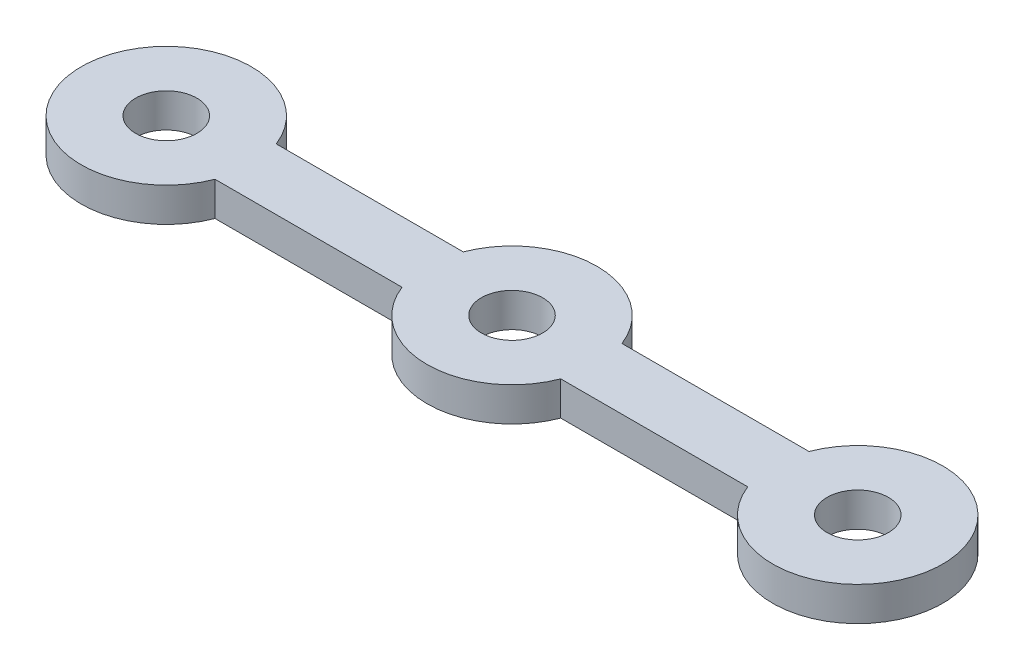
ISO-10303-21;
HEADER;
FILE_DESCRIPTION(('STEP AP214'),'2;1');
FILE_NAME('part.step','',(''),(''),'','','');
FILE_SCHEMA(('AUTOMOTIVE_DESIGN { 1 0 10303 214 1 1 1 1 }'));
ENDSEC;
DATA;
#1=APPLICATION_CONTEXT('core data for automotive mechanical design processes');
#2=APPLICATION_PROTOCOL_DEFINITION('international standard','automotive_design',2000,#1);
#3=PRODUCT_CONTEXT('',#1,'mechanical');
#4=PRODUCT('Part','Part','',(#3));
#5=PRODUCT_RELATED_PRODUCT_CATEGORY('part','',(#4));
#6=PRODUCT_DEFINITION_FORMATION('','',#4);
#7=PRODUCT_DEFINITION_CONTEXT('part definition',#1,'design');
#8=PRODUCT_DEFINITION('design','',#6,#7);
#9=PRODUCT_DEFINITION_SHAPE('','',#8);
#10=(LENGTH_UNIT() NAMED_UNIT(*) SI_UNIT(.MILLI.,.METRE.));
#11=(NAMED_UNIT(*) PLANE_ANGLE_UNIT() SI_UNIT($,.RADIAN.));
#12=(NAMED_UNIT(*) SI_UNIT($,.STERADIAN.) SOLID_ANGLE_UNIT());
#13=UNCERTAINTY_MEASURE_WITH_UNIT(LENGTH_MEASURE(1.E-05),#10,'distance_accuracy_value','');
#14=(GEOMETRIC_REPRESENTATION_CONTEXT(3) GLOBAL_UNCERTAINTY_ASSIGNED_CONTEXT((#13)) GLOBAL_UNIT_ASSIGNED_CONTEXT((#10,
#11,#12)) REPRESENTATION_CONTEXT('',''));
#15=CARTESIAN_POINT('',(0.,0.,0.));
#16=DIRECTION('',(0.,0.,1.));
#17=DIRECTION('',(1.,0.,0.));
#18=AXIS2_PLACEMENT_3D('',#15,#16,#17);
#19=CARTESIAN_POINT('',(2032.46,100.,-3.73356845009254E-13));
#20=DIRECTION('',(0.,-1.,0.));
#21=DIRECTION('',(0.,0.,-1.));
#22=AXIS2_PLACEMENT_3D('',#19,#20,#21);
#23=CYLINDRICAL_SURFACE('',#22,250.);
#24=CARTESIAN_POINT('',(2032.46,0.,-3.73356845009254E-13));
#25=DIRECTION('',(0.,1.,0.));
#26=DIRECTION('',(0.,0.,1.));
#27=AXIS2_PLACEMENT_3D('',#24,#25,#26);
#28=CIRCLE('',#27,250.);
#29=CARTESIAN_POINT('',(1799.22192420619,0.,89.9999999999997));
#30=VERTEX_POINT('',#29);
#31=CARTESIAN_POINT('',(1799.22192420619,0.,-90.0000000000003));
#32=VERTEX_POINT('',#31);
#33=EDGE_CURVE('E145',#30,#32,#28,.T.);
#34=ORIENTED_EDGE('',*,*,#33,.T.);
#35=DIRECTION('',(0.,-1.,0.));
#36=VECTOR('',#35,1.);
#37=CARTESIAN_POINT('',(1799.22192420619,100.,-90.0000000000003));
#38=LINE('',#37,#36);
#39=CARTESIAN_POINT('',(1799.22192420619,100.,-90.0000000000003));
#40=VERTEX_POINT('',#39);
#41=EDGE_CURVE('E11',#40,#32,#38,.T.);
#42=ORIENTED_EDGE('',*,*,#41,.F.);
#43=CARTESIAN_POINT('',(2032.46,100.,-3.73356845009254E-13));
#44=DIRECTION('',(0.,1.,0.));
#45=DIRECTION('',(0.,0.,1.));
#46=AXIS2_PLACEMENT_3D('',#43,#44,#45);
#47=CIRCLE('',#46,250.);
#48=CARTESIAN_POINT('',(1799.22192420619,100.,89.9999999999997));
#49=VERTEX_POINT('',#48);
#50=EDGE_CURVE('E95',#49,#40,#47,.T.);
#51=ORIENTED_EDGE('',*,*,#50,.F.);
#52=DIRECTION('',(0.,-1.,0.));
#53=VECTOR('',#52,1.);
#54=CARTESIAN_POINT('',(1799.22192420619,100.,89.9999999999997));
#55=LINE('',#54,#53);
#56=EDGE_CURVE('E144',#49,#30,#55,.T.);
#57=ORIENTED_EDGE('',*,*,#56,.T.);
#58=EDGE_LOOP('',(#34,#42,#51,#57));
#59=FACE_BOUND('',#58,.T.);
#60=ADVANCED_FACE('F39',(#59),#23,.T.);
#61=CARTESIAN_POINT('',(0.,100.,-89.9999999999999));
#62=DIRECTION('',(0.,0.,-1.));
#63=DIRECTION('',(-1.,0.,0.));
#64=AXIS2_PLACEMENT_3D('',#61,#62,#63);
#65=PLANE('',#64);
#66=DIRECTION('',(1.,0.,0.));
#67=VECTOR('',#66,1.);
#68=CARTESIAN_POINT('',(0.,0.,-89.9999999999999));
#69=LINE('',#68,#67);
#70=CARTESIAN_POINT('',(1249.46807579381,0.,-90.0000000000002));
#71=VERTEX_POINT('',#70);
#72=EDGE_CURVE('E148',#71,#32,#69,.T.);
#73=ORIENTED_EDGE('',*,*,#72,.F.);
#74=DIRECTION('',(0.,-1.,0.));
#75=VECTOR('',#74,1.);
#76=CARTESIAN_POINT('',(1249.46807579381,100.,-90.0000000000002));
#77=LINE('',#76,#75);
#78=CARTESIAN_POINT('',(1249.46807579381,100.,-90.0000000000002));
#79=VERTEX_POINT('',#78);
#80=EDGE_CURVE('E47',#79,#71,#77,.T.);
#81=ORIENTED_EDGE('',*,*,#80,.F.);
#82=DIRECTION('',(1.,0.,0.));
#83=VECTOR('',#82,1.);
#84=CARTESIAN_POINT('',(0.,100.,-89.9999999999999));
#85=LINE('',#84,#83);
#86=EDGE_CURVE('E193',#79,#40,#85,.T.);
#87=ORIENTED_EDGE('',*,*,#86,.T.);
#88=ORIENTED_EDGE('',*,*,#41,.T.);
#89=EDGE_LOOP('',(#73,#81,#87,#88));
#90=FACE_BOUND('',#89,.T.);
#91=ADVANCED_FACE('F192',(#90),#65,.T.);
#92=CARTESIAN_POINT('',(1016.23,100.,0.));
#93=DIRECTION('',(0.,-1.,0.));
#94=DIRECTION('',(0.,0.,-1.));
#95=AXIS2_PLACEMENT_3D('',#92,#93,#94);
#96=CYLINDRICAL_SURFACE('',#95,250.);
#97=CARTESIAN_POINT('',(1016.23,0.,0.));
#98=DIRECTION('',(0.,1.,0.));
#99=DIRECTION('',(0.,0.,1.));
#100=AXIS2_PLACEMENT_3D('',#97,#98,#99);
#101=CIRCLE('',#100,250.);
#102=CARTESIAN_POINT('',(782.991924206188,0.,-90.0000000000001));
#103=VERTEX_POINT('',#102);
#104=EDGE_CURVE('E151',#71,#103,#101,.T.);
#105=ORIENTED_EDGE('',*,*,#104,.T.);
#106=DIRECTION('',(0.,-1.,0.));
#107=VECTOR('',#106,1.);
#108=CARTESIAN_POINT('',(782.991924206188,100.,-90.0000000000001));
#109=LINE('',#108,#107);
#110=CARTESIAN_POINT('',(782.991924206188,100.,-90.0000000000001));
#111=VERTEX_POINT('',#110);
#112=EDGE_CURVE('E176',#111,#103,#109,.T.);
#113=ORIENTED_EDGE('',*,*,#112,.F.);
#114=CARTESIAN_POINT('',(1016.23,100.,0.));
#115=DIRECTION('',(0.,1.,0.));
#116=DIRECTION('',(0.,0.,1.));
#117=AXIS2_PLACEMENT_3D('',#114,#115,#116);
#118=CIRCLE('',#117,250.);
#119=EDGE_CURVE('E182',#79,#111,#118,.T.);
#120=ORIENTED_EDGE('',*,*,#119,.F.);
#121=ORIENTED_EDGE('',*,*,#80,.T.);
#122=EDGE_LOOP('',(#105,#113,#120,#121));
#123=FACE_BOUND('',#122,.T.);
#124=ADVANCED_FACE('F180',(#123),#96,.T.);
#125=CARTESIAN_POINT('',(0.,100.,-89.9999999999999));
#126=DIRECTION('',(0.,0.,-1.));
#127=DIRECTION('',(-1.,0.,0.));
#128=AXIS2_PLACEMENT_3D('',#125,#126,#127);
#129=PLANE('',#128);
#130=DIRECTION('',(1.,0.,0.));
#131=VECTOR('',#130,1.);
#132=CARTESIAN_POINT('',(0.,0.,-89.9999999999999));
#133=LINE('',#132,#131);
#134=CARTESIAN_POINT('',(233.238075793812,0.,-90.));
#135=VERTEX_POINT('',#134);
#136=EDGE_CURVE('E154',#135,#103,#133,.T.);
#137=ORIENTED_EDGE('',*,*,#136,.F.);
#138=DIRECTION('',(0.,-1.,0.));
#139=VECTOR('',#138,1.);
#140=CARTESIAN_POINT('',(233.238075793812,100.,-90.));
#141=LINE('',#140,#139);
#142=CARTESIAN_POINT('',(233.238075793812,100.,-90.));
#143=VERTEX_POINT('',#142);
#144=EDGE_CURVE('E174',#143,#135,#141,.T.);
#145=ORIENTED_EDGE('',*,*,#144,.F.);
#146=DIRECTION('',(1.,0.,0.));
#147=VECTOR('',#146,1.);
#148=CARTESIAN_POINT('',(0.,100.,-89.9999999999999));
#149=LINE('',#148,#147);
#150=EDGE_CURVE('E199',#143,#111,#149,.T.);
#151=ORIENTED_EDGE('',*,*,#150,.T.);
#152=ORIENTED_EDGE('',*,*,#112,.T.);
#153=EDGE_LOOP('',(#137,#145,#151,#152));
#154=FACE_BOUND('',#153,.T.);
#155=ADVANCED_FACE('F197',(#154),#129,.T.);
#156=CARTESIAN_POINT('',(0.,100.,0.));
#157=DIRECTION('',(0.,-1.,0.));
#158=DIRECTION('',(0.,0.,-1.));
#159=AXIS2_PLACEMENT_3D('',#156,#157,#158);
#160=CYLINDRICAL_SURFACE('',#159,250.);
#161=CARTESIAN_POINT('',(0.,0.,0.));
#162=DIRECTION('',(0.,1.,0.));
#163=DIRECTION('',(0.,0.,1.));
#164=AXIS2_PLACEMENT_3D('',#161,#162,#163);
#165=CIRCLE('',#164,250.);
#166=CARTESIAN_POINT('',(233.238075793812,0.,90.));
#167=VERTEX_POINT('',#166);
#168=EDGE_CURVE('E157',#135,#167,#165,.T.);
#169=ORIENTED_EDGE('',*,*,#168,.T.);
#170=DIRECTION('',(0.,-1.,0.));
#171=VECTOR('',#170,1.);
#172=CARTESIAN_POINT('',(233.238075793812,100.,90.));
#173=LINE('',#172,#171);
#174=CARTESIAN_POINT('',(233.238075793812,100.,90.));
#175=VERTEX_POINT('',#174);
#176=EDGE_CURVE('E127',#175,#167,#173,.T.);
#177=ORIENTED_EDGE('',*,*,#176,.F.);
#178=CARTESIAN_POINT('',(0.,100.,0.));
#179=DIRECTION('',(0.,1.,0.));
#180=DIRECTION('',(0.,0.,1.));
#181=AXIS2_PLACEMENT_3D('',#178,#179,#180);
#182=CIRCLE('',#181,250.);
#183=EDGE_CURVE('E118',#143,#175,#182,.T.);
#184=ORIENTED_EDGE('',*,*,#183,.F.);
#185=ORIENTED_EDGE('',*,*,#144,.T.);
#186=EDGE_LOOP('',(#169,#177,#184,#185));
#187=FACE_BOUND('',#186,.T.);
#188=ADVANCED_FACE('F204',(#187),#160,.T.);
#189=CARTESIAN_POINT('',(0.,100.,90.));
#190=DIRECTION('',(0.,0.,-1.));
#191=DIRECTION('',(-1.,0.,0.));
#192=AXIS2_PLACEMENT_3D('',#189,#190,#191);
#193=PLANE('',#192);
#194=DIRECTION('',(1.,0.,0.));
#195=VECTOR('',#194,1.);
#196=CARTESIAN_POINT('',(0.,0.,90.));
#197=LINE('',#196,#195);
#198=CARTESIAN_POINT('',(782.991924206188,0.,89.9999999999999));
#199=VERTEX_POINT('',#198);
#200=EDGE_CURVE('E126',#167,#199,#197,.T.);
#201=ORIENTED_EDGE('',*,*,#200,.T.);
#202=DIRECTION('',(0.,-1.,0.));
#203=VECTOR('',#202,1.);
#204=CARTESIAN_POINT('',(782.991924206188,100.,89.9999999999999));
#205=LINE('',#204,#203);
#206=CARTESIAN_POINT('',(782.991924206188,100.,89.9999999999999));
#207=VERTEX_POINT('',#206);
#208=EDGE_CURVE('E123',#207,#199,#205,.T.);
#209=ORIENTED_EDGE('',*,*,#208,.F.);
#210=DIRECTION('',(1.,0.,0.));
#211=VECTOR('',#210,1.);
#212=CARTESIAN_POINT('',(0.,100.,90.));
#213=LINE('',#212,#211);
#214=EDGE_CURVE('E110',#175,#207,#213,.T.);
#215=ORIENTED_EDGE('',*,*,#214,.F.);
#216=ORIENTED_EDGE('',*,*,#176,.T.);
#217=EDGE_LOOP('',(#201,#209,#215,#216));
#218=FACE_BOUND('',#217,.T.);
#219=ADVANCED_FACE('F124',(#218),#193,.F.);
#220=CARTESIAN_POINT('',(1016.23,100.,0.));
#221=DIRECTION('',(0.,-1.,0.));
#222=DIRECTION('',(0.,0.,-1.));
#223=AXIS2_PLACEMENT_3D('',#220,#221,#222);
#224=CYLINDRICAL_SURFACE('',#223,250.);
#225=CARTESIAN_POINT('',(1016.23,0.,0.));
#226=DIRECTION('',(0.,1.,0.));
#227=DIRECTION('',(0.,0.,1.));
#228=AXIS2_PLACEMENT_3D('',#225,#226,#227);
#229=CIRCLE('',#228,250.);
#230=CARTESIAN_POINT('',(1249.46807579381,0.,89.9999999999998));
#231=VERTEX_POINT('',#230);
#232=EDGE_CURVE('E83',#199,#231,#229,.T.);
#233=ORIENTED_EDGE('',*,*,#232,.T.);
#234=DIRECTION('',(0.,-1.,0.));
#235=VECTOR('',#234,1.);
#236=CARTESIAN_POINT('',(1249.46807579381,100.,89.9999999999998));
#237=LINE('',#236,#235);
#238=CARTESIAN_POINT('',(1249.46807579381,100.,89.9999999999998));
#239=VERTEX_POINT('',#238);
#240=EDGE_CURVE('E128',#239,#231,#237,.T.);
#241=ORIENTED_EDGE('',*,*,#240,.F.);
#242=CARTESIAN_POINT('',(1016.23,100.,0.));
#243=DIRECTION('',(0.,1.,0.));
#244=DIRECTION('',(0.,0.,1.));
#245=AXIS2_PLACEMENT_3D('',#242,#243,#244);
#246=CIRCLE('',#245,250.);
#247=EDGE_CURVE('E115',#207,#239,#246,.T.);
#248=ORIENTED_EDGE('',*,*,#247,.F.);
#249=ORIENTED_EDGE('',*,*,#208,.T.);
#250=EDGE_LOOP('',(#233,#241,#248,#249));
#251=FACE_BOUND('',#250,.T.);
#252=ADVANCED_FACE('F130',(#251),#224,.T.);
#253=CARTESIAN_POINT('',(0.,100.,0.));
#254=DIRECTION('',(0.,-1.,0.));
#255=DIRECTION('',(0.,0.,-1.));
#256=AXIS2_PLACEMENT_3D('',#253,#254,#255);
#257=CYLINDRICAL_SURFACE('',#256,90.);
#258=CARTESIAN_POINT('',(0.,100.,0.));
#259=DIRECTION('',(0.,1.,0.));
#260=DIRECTION('',(0.,0.,1.));
#261=AXIS2_PLACEMENT_3D('',#258,#259,#260);
#262=CIRCLE('',#261,90.);
#263=CARTESIAN_POINT('',(0.,100.,90.));
#264=VERTEX_POINT('',#263);
#265=EDGE_CURVE('E138',#264,#264,#262,.T.);
#266=ORIENTED_EDGE('',*,*,#265,.T.);
#267=EDGE_LOOP('',(#266));
#268=FACE_BOUND('',#267,.T.);
#269=CARTESIAN_POINT('',(0.,0.,0.));
#270=DIRECTION('',(0.,1.,0.));
#271=DIRECTION('',(0.,0.,1.));
#272=AXIS2_PLACEMENT_3D('',#269,#270,#271);
#273=CIRCLE('',#272,90.);
#274=CARTESIAN_POINT('',(0.,0.,90.));
#275=VERTEX_POINT('',#274);
#276=EDGE_CURVE('E165',#275,#275,#273,.T.);
#277=ORIENTED_EDGE('',*,*,#276,.F.);
#278=EDGE_LOOP('',(#277));
#279=FACE_BOUND('',#278,.T.);
#280=ADVANCED_FACE('F249',(#268,#279),#257,.F.);
#281=CARTESIAN_POINT('',(1016.23,100.,0.));
#282=DIRECTION('',(0.,-1.,0.));
#283=DIRECTION('',(0.,0.,-1.));
#284=AXIS2_PLACEMENT_3D('',#281,#282,#283);
#285=CYLINDRICAL_SURFACE('',#284,90.0000000000002);
#286=CARTESIAN_POINT('',(1016.23,100.,0.));
#287=DIRECTION('',(0.,1.,0.));
#288=DIRECTION('',(0.,0.,1.));
#289=AXIS2_PLACEMENT_3D('',#286,#287,#288);
#290=CIRCLE('',#289,90.0000000000002);
#291=CARTESIAN_POINT('',(1016.23,100.,90.0000000000002));
#292=VERTEX_POINT('',#291);
#293=EDGE_CURVE('E132',#292,#292,#290,.T.);
#294=ORIENTED_EDGE('',*,*,#293,.T.);
#295=EDGE_LOOP('',(#294));
#296=FACE_BOUND('',#295,.T.);
#297=CARTESIAN_POINT('',(1016.23,0.,0.));
#298=DIRECTION('',(0.,1.,0.));
#299=DIRECTION('',(0.,0.,1.));
#300=AXIS2_PLACEMENT_3D('',#297,#298,#299);
#301=CIRCLE('',#300,90.0000000000002);
#302=CARTESIAN_POINT('',(1016.23,0.,90.0000000000002));
#303=VERTEX_POINT('',#302);
#304=EDGE_CURVE('E162',#303,#303,#301,.T.);
#305=ORIENTED_EDGE('',*,*,#304,.F.);
#306=EDGE_LOOP('',(#305));
#307=FACE_BOUND('',#306,.T.);
#308=ADVANCED_FACE('F259',(#296,#307),#285,.F.);
#309=CARTESIAN_POINT('',(0.,100.,90.));
#310=DIRECTION('',(0.,0.,-1.));
#311=DIRECTION('',(-1.,0.,0.));
#312=AXIS2_PLACEMENT_3D('',#309,#310,#311);
#313=PLANE('',#312);
#314=DIRECTION('',(1.,0.,0.));
#315=VECTOR('',#314,1.);
#316=CARTESIAN_POINT('',(0.,0.,90.));
#317=LINE('',#316,#315);
#318=EDGE_CURVE('E89',#231,#30,#317,.T.);
#319=ORIENTED_EDGE('',*,*,#318,.T.);
#320=ORIENTED_EDGE('',*,*,#56,.F.);
#321=DIRECTION('',(1.,0.,0.));
#322=VECTOR('',#321,1.);
#323=CARTESIAN_POINT('',(0.,100.,90.));
#324=LINE('',#323,#322);
#325=EDGE_CURVE('E55',#239,#49,#324,.T.);
#326=ORIENTED_EDGE('',*,*,#325,.F.);
#327=ORIENTED_EDGE('',*,*,#240,.T.);
#328=EDGE_LOOP('',(#319,#320,#326,#327));
#329=FACE_BOUND('',#328,.T.);
#330=ADVANCED_FACE('F270',(#329),#313,.F.);
#331=CARTESIAN_POINT('',(2032.46,100.,-3.73356845009254E-13));
#332=DIRECTION('',(0.,-1.,0.));
#333=DIRECTION('',(0.,0.,-1.));
#334=AXIS2_PLACEMENT_3D('',#331,#332,#333);
#335=CYLINDRICAL_SURFACE('',#334,89.9999999999999);
#336=CARTESIAN_POINT('',(2032.46,100.,-3.73356845009254E-13));
#337=DIRECTION('',(0.,1.,0.));
#338=DIRECTION('',(0.,0.,1.));
#339=AXIS2_PLACEMENT_3D('',#336,#337,#338);
#340=CIRCLE('',#339,89.9999999999999);
#341=CARTESIAN_POINT('',(2032.46,100.,89.9999999999996));
#342=VERTEX_POINT('',#341);
#343=EDGE_CURVE('E141',#342,#342,#340,.T.);
#344=ORIENTED_EDGE('',*,*,#343,.T.);
#345=EDGE_LOOP('',(#344));
#346=FACE_BOUND('',#345,.T.);
#347=CARTESIAN_POINT('',(2032.46,0.,-3.73356845009254E-13));
#348=DIRECTION('',(0.,1.,0.));
#349=DIRECTION('',(0.,0.,1.));
#350=AXIS2_PLACEMENT_3D('',#347,#348,#349);
#351=CIRCLE('',#350,89.9999999999999);
#352=CARTESIAN_POINT('',(2032.46,0.,89.9999999999996));
#353=VERTEX_POINT('',#352);
#354=EDGE_CURVE('E168',#353,#353,#351,.T.);
#355=ORIENTED_EDGE('',*,*,#354,.F.);
#356=EDGE_LOOP('',(#355));
#357=FACE_BOUND('',#356,.T.);
#358=ADVANCED_FACE('F281',(#346,#357),#335,.F.);
#359=CARTESIAN_POINT('',(0.,100.,0.));
#360=DIRECTION('',(0.,1.,0.));
#361=DIRECTION('',(0.,0.,1.));
#362=AXIS2_PLACEMENT_3D('',#359,#360,#361);
#363=PLANE('',#362);
#364=ORIENTED_EDGE('',*,*,#50,.T.);
#365=ORIENTED_EDGE('',*,*,#86,.F.);
#366=ORIENTED_EDGE('',*,*,#119,.T.);
#367=ORIENTED_EDGE('',*,*,#150,.F.);
#368=ORIENTED_EDGE('',*,*,#183,.T.);
#369=ORIENTED_EDGE('',*,*,#214,.T.);
#370=ORIENTED_EDGE('',*,*,#247,.T.);
#371=ORIENTED_EDGE('',*,*,#325,.T.);
#372=EDGE_LOOP('',(#364,#365,#366,#367,#368,#369,#370,#371));
#373=FACE_BOUND('',#372,.T.);
#374=ORIENTED_EDGE('',*,*,#293,.F.);
#375=EDGE_LOOP('',(#374));
#376=FACE_BOUND('',#375,.T.);
#377=ORIENTED_EDGE('',*,*,#265,.F.);
#378=EDGE_LOOP('',(#377));
#379=FACE_BOUND('',#378,.T.);
#380=ORIENTED_EDGE('',*,*,#343,.F.);
#381=EDGE_LOOP('',(#380));
#382=FACE_BOUND('',#381,.T.);
#383=ADVANCED_FACE('F112',(#373,#376,#379,#382),#363,.T.);
#384=CARTESIAN_POINT('',(0.,0.,0.));
#385=DIRECTION('',(0.,1.,0.));
#386=DIRECTION('',(0.,0.,1.));
#387=AXIS2_PLACEMENT_3D('',#384,#385,#386);
#388=PLANE('',#387);
#389=ORIENTED_EDGE('',*,*,#33,.F.);
#390=ORIENTED_EDGE('',*,*,#318,.F.);
#391=ORIENTED_EDGE('',*,*,#232,.F.);
#392=ORIENTED_EDGE('',*,*,#200,.F.);
#393=ORIENTED_EDGE('',*,*,#168,.F.);
#394=ORIENTED_EDGE('',*,*,#136,.T.);
#395=ORIENTED_EDGE('',*,*,#104,.F.);
#396=ORIENTED_EDGE('',*,*,#72,.T.);
#397=EDGE_LOOP('',(#389,#390,#391,#392,#393,#394,#395,#396));
#398=FACE_BOUND('',#397,.T.);
#399=ORIENTED_EDGE('',*,*,#304,.T.);
#400=EDGE_LOOP('',(#399));
#401=FACE_BOUND('',#400,.T.);
#402=ORIENTED_EDGE('',*,*,#276,.T.);
#403=EDGE_LOOP('',(#402));
#404=FACE_BOUND('',#403,.T.);
#405=ORIENTED_EDGE('',*,*,#354,.T.);
#406=EDGE_LOOP('',(#405));
#407=FACE_BOUND('',#406,.T.);
#408=ADVANCED_FACE('F188',(#398,#401,#404,#407),#388,.F.);
#409=CLOSED_SHELL('',(#60,#91,#124,#155,#188,#219,#252,#280,#308,#330,#358,#383,#408));
#410=MANIFOLD_SOLID_BREP('B2',#409);
#411=ADVANCED_BREP_SHAPE_REPRESENTATION('',(#18,#410),#14);
#412=SHAPE_DEFINITION_REPRESENTATION(#9,#411);
ENDSEC;
END-ISO-10303-21;
